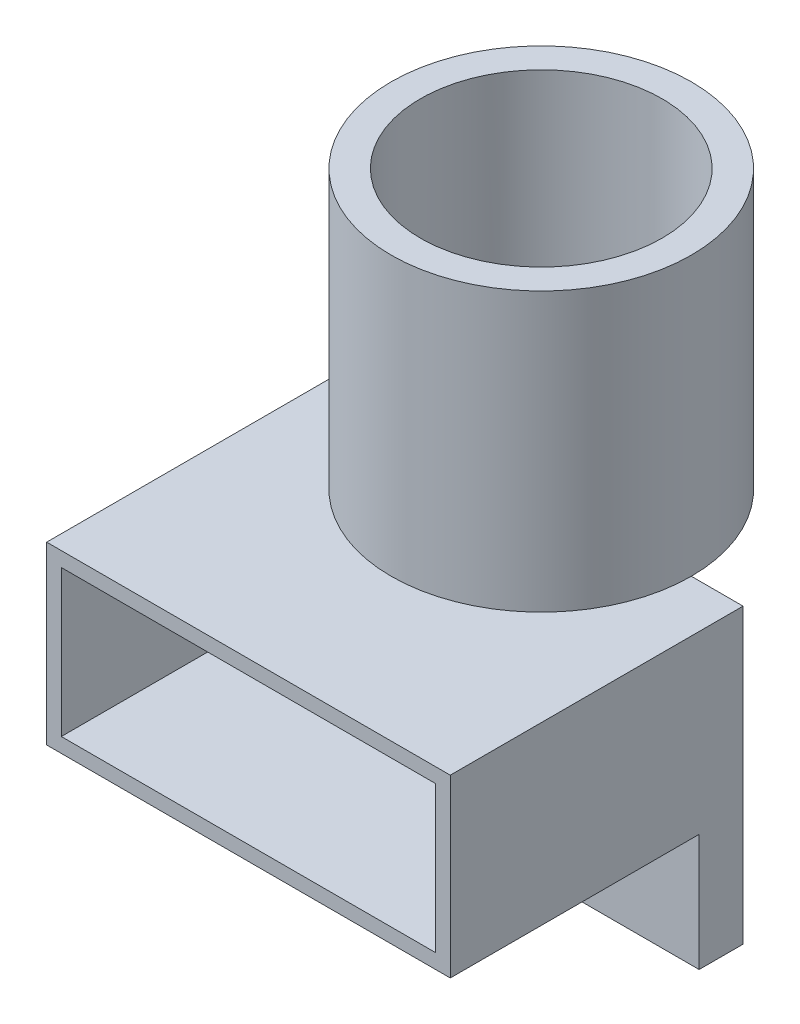
ISO-10303-21;
HEADER;
FILE_DESCRIPTION(('STEP AP214'),'2;1');
FILE_NAME('part.step','',(''),(''),'','','');
FILE_SCHEMA(('AUTOMOTIVE_DESIGN { 1 0 10303 214 1 1 1 1 }'));
ENDSEC;
DATA;
#1=APPLICATION_CONTEXT('core data for automotive mechanical design processes');
#2=APPLICATION_PROTOCOL_DEFINITION('international standard','automotive_design',2000,#1);
#3=PRODUCT_CONTEXT('',#1,'mechanical');
#4=PRODUCT('Part','Part','',(#3));
#5=PRODUCT_RELATED_PRODUCT_CATEGORY('part','',(#4));
#6=PRODUCT_DEFINITION_FORMATION('','',#4);
#7=PRODUCT_DEFINITION_CONTEXT('part definition',#1,'design');
#8=PRODUCT_DEFINITION('design','',#6,#7);
#9=PRODUCT_DEFINITION_SHAPE('','',#8);
#10=(LENGTH_UNIT() NAMED_UNIT(*) SI_UNIT(.MILLI.,.METRE.));
#11=(NAMED_UNIT(*) PLANE_ANGLE_UNIT() SI_UNIT($,.RADIAN.));
#12=(NAMED_UNIT(*) SI_UNIT($,.STERADIAN.) SOLID_ANGLE_UNIT());
#13=UNCERTAINTY_MEASURE_WITH_UNIT(LENGTH_MEASURE(1.E-05),#10,'distance_accuracy_value','');
#14=(GEOMETRIC_REPRESENTATION_CONTEXT(3) GLOBAL_UNCERTAINTY_ASSIGNED_CONTEXT((#13)) GLOBAL_UNIT_ASSIGNED_CONTEXT((#10,
#11,#12)) REPRESENTATION_CONTEXT('',''));
#15=CARTESIAN_POINT('',(0.,0.,0.));
#16=DIRECTION('',(0.,0.,1.));
#17=DIRECTION('',(1.,0.,0.));
#18=AXIS2_PLACEMENT_3D('',#15,#16,#17);
#19=CARTESIAN_POINT('',(-13.785,-12.,20.));
#20=DIRECTION('',(0.,1.,0.));
#21=DIRECTION('',(0.,0.,1.));
#22=AXIS2_PLACEMENT_3D('',#19,#20,#21);
#23=PLANE('',#22);
#24=DIRECTION('',(-1.,0.,0.));
#25=VECTOR('',#24,1.);
#26=CARTESIAN_POINT('',(-13.785,-12.,3.));
#27=LINE('',#26,#25);
#28=CARTESIAN_POINT('',(13.785,-12.,3.));
#29=VERTEX_POINT('',#28);
#30=CARTESIAN_POINT('',(-13.785,-12.,3.));
#31=VERTEX_POINT('',#30);
#32=EDGE_CURVE('E59',#29,#31,#27,.T.);
#33=ORIENTED_EDGE('',*,*,#32,.F.);
#34=DIRECTION('',(0.,0.,-1.));
#35=VECTOR('',#34,1.);
#36=CARTESIAN_POINT('',(13.785,-12.,20.));
#37=LINE('',#36,#35);
#38=CARTESIAN_POINT('',(13.785,-12.,20.));
#39=VERTEX_POINT('',#38);
#40=EDGE_CURVE('E232',#39,#29,#37,.T.);
#41=ORIENTED_EDGE('',*,*,#40,.F.);
#42=DIRECTION('',(1.,0.,0.));
#43=VECTOR('',#42,1.);
#44=CARTESIAN_POINT('',(-13.785,-12.,20.));
#45=LINE('',#44,#43);
#46=CARTESIAN_POINT('',(-13.785,-12.,20.));
#47=VERTEX_POINT('',#46);
#48=EDGE_CURVE('E217',#47,#39,#45,.T.);
#49=ORIENTED_EDGE('',*,*,#48,.F.);
#50=DIRECTION('',(0.,0.,-1.));
#51=VECTOR('',#50,1.);
#52=CARTESIAN_POINT('',(-13.785,-12.,20.));
#53=LINE('',#52,#51);
#54=EDGE_CURVE('E234',#47,#31,#53,.T.);
#55=ORIENTED_EDGE('',*,*,#54,.T.);
#56=EDGE_LOOP('',(#33,#41,#49,#55));
#57=FACE_BOUND('',#56,.T.);
#58=ADVANCED_FACE('F39',(#57),#23,.F.);
#59=CARTESIAN_POINT('',(0.,19.,0.));
#60=DIRECTION('',(0.,-1.,0.));
#61=DIRECTION('',(0.,0.,-1.));
#62=AXIS2_PLACEMENT_3D('',#59,#60,#61);
#63=CYLINDRICAL_SURFACE('',#62,10.255);
#64=CARTESIAN_POINT('',(0.,19.,0.));
#65=DIRECTION('',(0.,1.,0.));
#66=DIRECTION('',(0.,0.,1.));
#67=AXIS2_PLACEMENT_3D('',#64,#65,#66);
#68=CIRCLE('',#67,10.255);
#69=CARTESIAN_POINT('',(0.,19.,10.255));
#70=VERTEX_POINT('',#69);
#71=EDGE_CURVE('E254',#70,#70,#68,.T.);
#72=ORIENTED_EDGE('',*,*,#71,.F.);
#73=EDGE_LOOP('',(#72));
#74=FACE_BOUND('',#73,.T.);
#75=CARTESIAN_POINT('',(0.,0.,0.));
#76=DIRECTION('',(0.,-1.,0.));
#77=DIRECTION('',(0.,0.,-1.));
#78=AXIS2_PLACEMENT_3D('',#75,#76,#77);
#79=CIRCLE('',#78,10.255);
#80=CARTESIAN_POINT('',(10.255,0.,0.));
#81=VERTEX_POINT('',#80);
#82=CARTESIAN_POINT('',(-10.255,0.,0.));
#83=VERTEX_POINT('',#82);
#84=EDGE_CURVE('E239',#81,#83,#79,.T.);
#85=ORIENTED_EDGE('',*,*,#84,.F.);
#86=CARTESIAN_POINT('',(0.,0.,0.));
#87=DIRECTION('',(0.,1.,0.));
#88=DIRECTION('',(0.,0.,1.));
#89=AXIS2_PLACEMENT_3D('',#86,#87,#88);
#90=CIRCLE('',#89,10.255);
#91=EDGE_CURVE('E251',#81,#83,#90,.T.);
#92=ORIENTED_EDGE('',*,*,#91,.T.);
#93=EDGE_LOOP('',(#85,#92));
#94=FACE_BOUND('',#93,.T.);
#95=ADVANCED_FACE('F276',(#74,#94),#63,.T.);
#96=CARTESIAN_POINT('',(0.,19.,0.));
#97=DIRECTION('',(0.,-1.,0.));
#98=DIRECTION('',(0.,0.,-1.));
#99=AXIS2_PLACEMENT_3D('',#96,#97,#98);
#100=CYLINDRICAL_SURFACE('',#99,8.255);
#101=CARTESIAN_POINT('',(0.,19.,0.));
#102=DIRECTION('',(0.,1.,0.));
#103=DIRECTION('',(1.,0.,0.));
#104=AXIS2_PLACEMENT_3D('',#101,#102,#103);
#105=CIRCLE('',#104,8.255);
#106=CARTESIAN_POINT('',(8.255,19.,0.));
#107=VERTEX_POINT('',#106);
#108=EDGE_CURVE('E248',#107,#107,#105,.T.);
#109=ORIENTED_EDGE('',*,*,#108,.T.);
#110=EDGE_LOOP('',(#109));
#111=FACE_BOUND('',#110,.T.);
#112=CARTESIAN_POINT('',(0.,0.,0.));
#113=DIRECTION('',(0.,1.,0.));
#114=DIRECTION('',(1.,0.,0.));
#115=AXIS2_PLACEMENT_3D('',#112,#113,#114);
#116=CIRCLE('',#115,8.255);
#117=CARTESIAN_POINT('',(8.255,0.,0.));
#118=VERTEX_POINT('',#117);
#119=CARTESIAN_POINT('',(-8.255,0.,0.));
#120=VERTEX_POINT('',#119);
#121=EDGE_CURVE('E247',#118,#120,#116,.T.);
#122=ORIENTED_EDGE('',*,*,#121,.F.);
#123=DIRECTION('',(0.,-1.,0.));
#124=VECTOR('',#123,1.);
#125=CARTESIAN_POINT('',(8.255,-5.,0.));
#126=LINE('',#125,#124);
#127=CARTESIAN_POINT('',(8.255,-5.,0.));
#128=VERTEX_POINT('',#127);
#129=EDGE_CURVE('E262',#128,#118,#126,.F.);
#130=ORIENTED_EDGE('',*,*,#129,.F.);
#131=CARTESIAN_POINT('',(8.255,-5.,0.));
#132=CARTESIAN_POINT('',(8.25497331461349,-4.85988252701492,-1.49021935201769E-05));
#133=CARTESIAN_POINT('',(8.25499916117062,-4.71976715681473,0.00588924993427578));
#134=CARTESIAN_POINT('',(8.2549630650917,-4.44052956125955,0.0294281961175764));
#135=CARTESIAN_POINT('',(8.2549011253202,-4.30140730364727,0.0470626073940307));
#136=CARTESIAN_POINT('',(8.25449664300974,-4.02514658055255,0.0939527544222287));
#137=CARTESIAN_POINT('',(8.25415412277667,-3.88800795825498,0.123207566268263));
#138=CARTESIAN_POINT('',(8.25281510285722,-3.61667515296433,0.193126101982999));
#139=CARTESIAN_POINT('',(8.2518186113694,-3.48248093308039,0.23378968282139));
#140=CARTESIAN_POINT('',(8.24867967854686,-3.217921059573,0.326260476430858));
#141=CARTESIAN_POINT('',(8.24653663225715,-3.08755746543767,0.378073563363808));
#142=CARTESIAN_POINT('',(8.24049624153474,-2.83162951870208,0.492470531085829));
#143=CARTESIAN_POINT('',(8.23659828388386,-2.70606686034485,0.555058172098636));
#144=CARTESIAN_POINT('',(8.22635090749259,-2.46074896050054,0.690495489484591));
#145=CARTESIAN_POINT('',(8.22000215707984,-2.34099214578099,0.763342364742439));
#146=CARTESIAN_POINT('',(8.20408900119977,-2.10816171297895,0.91871876096218));
#147=CARTESIAN_POINT('',(8.19452476584704,-1.995087741714,1.0012477695424));
#148=CARTESIAN_POINT('',(8.17155011343072,-1.77809704432577,1.17399814559934));
#149=CARTESIAN_POINT('',(8.15819802707089,-1.67407052991278,1.26408927540027));
#150=CARTESIAN_POINT('',(8.12683641815329,-1.4741934695003,1.45211269175896));
#151=CARTESIAN_POINT('',(8.10882882381386,-1.37833956037644,1.5500417204495));
#152=CARTESIAN_POINT('',(8.06744957492375,-1.19557394862224,1.75270216639264));
#153=CARTESIAN_POINT('',(8.04408288835743,-1.10865407137235,1.85742721952175));
#154=CARTESIAN_POINT('',(7.99133814253856,-0.944281717758796,2.07263287725026));
#155=CARTESIAN_POINT('',(7.96196047470916,-0.866828625461257,2.18311310673502));
#156=CARTESIAN_POINT('',(7.89859695483386,-0.726115254424243,2.40195672457887));
#157=CARTESIAN_POINT('',(7.86498240699499,-0.662289004590599,2.51006425989123));
#158=CARTESIAN_POINT('',(7.7916561564975,-0.543662713628974,2.72918844376971));
#159=CARTESIAN_POINT('',(7.75194202363032,-0.488866288299333,2.84020623716102));
#160=CARTESIAN_POINT('',(7.6661934673308,-0.388330061312826,3.06413098359849));
#161=CARTESIAN_POINT('',(7.62014877113039,-0.342605281247342,3.17704073979718));
#162=CARTESIAN_POINT('',(7.52178671503046,-0.260243391702001,3.40337640005148));
#163=CARTESIAN_POINT('',(7.46947170048911,-0.223602899961471,3.51680209594647));
#164=CARTESIAN_POINT('',(7.35620720466247,-0.157692277546201,3.74813945890142));
#165=CARTESIAN_POINT('',(7.29497797226574,-0.128820326752928,3.86602738011827));
#166=CARTESIAN_POINT('',(7.16601185206531,-0.0801869862604324,4.10014317465971));
#167=CARTESIAN_POINT('',(7.09827302276098,-0.0604283248725657,4.2163705407736));
#168=CARTESIAN_POINT('',(6.95678978158156,-0.029448645632062,4.44592186517168));
#169=CARTESIAN_POINT('',(6.88305802285567,-0.0182101318957444,4.559251309013));
#170=CARTESIAN_POINT('',(6.72992975643756,-0.00348379542835875,4.78241147588552));
#171=CARTESIAN_POINT('',(6.65053780347084,1.01882175520652E-05,4.89224491144132));
#172=CARTESIAN_POINT('',(6.56848726877049,0.,5.));
#173=B_SPLINE_CURVE_WITH_KNOTS('',3,(#131,#132,#133,#134,#135,#136,#137,#138,#139,#140,#141,
#142,#143,#144,#145,#146,#147,#148,#149,#150,#151,#152,#153,#154,#155,#156,#157,#158,#159,#160,
#161,#162,#163,#164,#165,#166,#167,#168,#169,#170,#171,#172),.UNSPECIFIED.,.F.,.F.,(4,2,2,2,2,2,
2,2,2,2,2,2,2,2,2,2,2,2,2,2,4),(0.,0.420225119247416,0.840436526480485,1.26061453055927,
1.68078726715428,2.10118191780847,2.52172358099491,2.94215064399918,3.36255546789287,
3.77680834621314,4.19088992338354,4.60458917931134,5.01826150453521,5.40767296279356,
5.79723997554025,6.18744677858611,6.57750808099107,6.98484051177167,7.39229480958079,
7.79891012805147,8.20520186035512),.UNSPECIFIED.);
#174=CARTESIAN_POINT('',(6.56848726877049,0.,4.99999999999999));
#175=VERTEX_POINT('',#174);
#176=EDGE_CURVE('E12',#128,#175,#173,.T.);
#177=ORIENTED_EDGE('',*,*,#176,.T.);
#178=CARTESIAN_POINT('',(0.,0.,0.));
#179=DIRECTION('',(0.,-1.,0.));
#180=DIRECTION('',(0.,0.,-1.));
#181=AXIS2_PLACEMENT_3D('',#178,#179,#180);
#182=CIRCLE('',#181,8.255);
#183=CARTESIAN_POINT('',(-6.56848726877049,0.,5.));
#184=VERTEX_POINT('',#183);
#185=EDGE_CURVE('E236',#175,#184,#182,.T.);
#186=ORIENTED_EDGE('',*,*,#185,.T.);
#187=CARTESIAN_POINT('',(-6.56848726877049,0.,5.));
#188=CARTESIAN_POINT('',(-6.65234995484222,1.12039857409779E-05,4.88986755808025));
#189=CARTESIAN_POINT('',(-6.73343478311541,-0.00363927133751894,4.77756140971143));
#190=CARTESIAN_POINT('',(-6.88968636795299,-0.0190410512372556,4.5493174870373));
#191=CARTESIAN_POINT('',(-6.96484830200669,-0.0307988825356666,4.43337685867417));
#192=CARTESIAN_POINT('',(-7.10893792075538,-0.0632364943649566,4.19846197129244));
#193=CARTESIAN_POINT('',(-7.17784928778702,-0.0839388577831941,4.07948075568399));
#194=CARTESIAN_POINT('',(-7.30884334610591,-0.134914726557473,3.83985233097008));
#195=CARTESIAN_POINT('',(-7.37092792320918,-0.165185579739175,3.71920559236199));
#196=CARTESIAN_POINT('',(-7.4883480228647,-0.235990029396108,3.47676681461346));
#197=CARTESIAN_POINT('',(-7.54364541326722,-0.276577997066371,3.35497210632506));
#198=CARTESIAN_POINT('',(-7.64698865632897,-0.368243900344679,3.1122325884408));
#199=CARTESIAN_POINT('',(-7.69503384447616,-0.41932279621492,2.99128785769443));
#200=CARTESIAN_POINT('',(-7.78383116610327,-0.531919368292093,2.75195495877767));
#201=CARTESIAN_POINT('',(-7.82459896452051,-0.593414053626837,2.63356179368059));
#202=CARTESIAN_POINT('',(-7.89921659867603,-0.726758502469405,2.40049463586602));
#203=CARTESIAN_POINT('',(-7.93306702129016,-0.79860738663583,2.28582032833268));
#204=CARTESIAN_POINT('',(-7.99177237192207,-0.945982761915618,2.07074709121387));
#205=CARTESIAN_POINT('',(-8.01713716760628,-1.0207252621898,1.96994845015721));
#206=CARTESIAN_POINT('',(-8.06285819475469,-1.17822975342711,1.77355914972444));
#207=CARTESIAN_POINT('',(-8.08321266925263,-1.26099454342173,1.6779703263946));
#208=CARTESIAN_POINT('',(-8.1194366269714,-1.43403200034803,1.49287432260273));
#209=CARTESIAN_POINT('',(-8.13530441799617,-1.5243074834405,1.40336944640213));
#210=CARTESIAN_POINT('',(-8.16313480705727,-1.71178121281649,1.23120430129868));
#211=CARTESIAN_POINT('',(-8.17509597189955,-1.8089819838331,1.14854655263068));
#212=CARTESIAN_POINT('',(-8.19586299152697,-2.01107029691955,0.989631170096774));
#213=CARTESIAN_POINT('',(-8.20462136255448,-2.1160477665559,0.91348175230814));
#214=CARTESIAN_POINT('',(-8.21937635708455,-2.33173954076825,0.769491482347934));
#215=CARTESIAN_POINT('',(-8.22537285877517,-2.44245409813836,0.701650996737772));
#216=CARTESIAN_POINT('',(-8.23521501141591,-2.66894064263214,0.574729420678005));
#217=CARTESIAN_POINT('',(-8.23905983604071,-2.78471455436314,0.5156517018546));
#218=CARTESIAN_POINT('',(-8.24515634275062,-3.02050929402075,0.406691494903264));
#219=CARTESIAN_POINT('',(-8.24740843040359,-3.1405290326286,0.35680666832988));
#220=CARTESIAN_POINT('',(-8.25105539295605,-3.40088562092269,0.260309670068906));
#221=CARTESIAN_POINT('',(-8.25228954128175,-3.54174452935713,0.215093861170852));
#222=CARTESIAN_POINT('',(-8.25394905104013,-3.82693203364714,0.137308667318047));
#223=CARTESIAN_POINT('',(-8.25437429541961,-3.97126112859974,0.104741113183223));
#224=CARTESIAN_POINT('',(-8.25487700095012,-4.26241288174185,0.0524903487073743));
#225=CARTESIAN_POINT('',(-8.25495404524261,-4.40923831763943,0.0328226058323825));
#226=CARTESIAN_POINT('',(-8.25499896371693,-4.70404188862832,0.00656857746174367));
#227=CARTESIAN_POINT('',(-8.25496684661968,-4.85201993069543,-1.8752963271178E-05));
#228=CARTESIAN_POINT('',(-8.255,-5.,0.));
#229=B_SPLINE_CURVE_WITH_KNOTS('',3,(#187,#188,#189,#190,#191,#192,#193,#194,#195,#196,#197,
#198,#199,#200,#201,#202,#203,#204,#205,#206,#207,#208,#209,#210,#211,#212,#213,#214,#215,#216,
#217,#218,#219,#220,#221,#222,#223,#224,#225,#226,#227,#228),.UNSPECIFIED.,.F.,.F.,(4,2,2,2,2,2,
2,2,2,2,2,2,2,2,2,2,2,2,2,2,4),(0.,0.415258865613753,0.830852420897809,1.24750144280537,
1.66403507991079,2.08281108513076,2.50162543911427,2.91952710842384,3.33739330787984,
3.72101299191601,4.10476700860083,4.48866556934857,4.87270481023969,5.2622266849412,
5.65176573781821,6.04145428593707,6.43104356963867,6.87427557709155,7.31757171796288,
7.76139842424205,8.20518967397719),.UNSPECIFIED.);
#230=CARTESIAN_POINT('',(-8.255,-5.,0.));
#231=VERTEX_POINT('',#230);
#232=EDGE_CURVE('E52',#184,#231,#229,.T.);
#233=ORIENTED_EDGE('',*,*,#232,.T.);
#234=DIRECTION('',(0.,-1.,0.));
#235=VECTOR('',#234,1.);
#236=CARTESIAN_POINT('',(-8.255,0.,0.));
#237=LINE('',#236,#235);
#238=EDGE_CURVE('E67',#120,#231,#237,.T.);
#239=ORIENTED_EDGE('',*,*,#238,.F.);
#240=EDGE_LOOP('',(#122,#130,#177,#186,#233,#239));
#241=FACE_BOUND('',#240,.T.);
#242=ADVANCED_FACE('F270',(#111,#241),#100,.F.);
#243=CARTESIAN_POINT('',(0.,0.,0.));
#244=DIRECTION('',(0.,1.,0.));
#245=DIRECTION('',(0.,0.,1.));
#246=AXIS2_PLACEMENT_3D('',#243,#244,#245);
#247=PLANE('',#246);
#248=DIRECTION('',(1.,0.,0.));
#249=VECTOR('',#248,1.);
#250=CARTESIAN_POINT('',(8.255,0.,0.));
#251=LINE('',#250,#249);
#252=EDGE_CURVE('E242',#118,#81,#251,.T.);
#253=ORIENTED_EDGE('',*,*,#252,.F.);
#254=ORIENTED_EDGE('',*,*,#121,.T.);
#255=DIRECTION('',(1.,0.,0.));
#256=VECTOR('',#255,1.);
#257=CARTESIAN_POINT('',(-10.255,0.,0.));
#258=LINE('',#257,#256);
#259=EDGE_CURVE('E245',#83,#120,#258,.T.);
#260=ORIENTED_EDGE('',*,*,#259,.F.);
#261=ORIENTED_EDGE('',*,*,#91,.F.);
#262=EDGE_LOOP('',(#253,#254,#260,#261));
#263=FACE_BOUND('',#262,.T.);
#264=ADVANCED_FACE('F275',(#263),#247,.F.);
#265=CARTESIAN_POINT('',(0.,19.,0.));
#266=DIRECTION('',(0.,1.,0.));
#267=DIRECTION('',(0.,0.,1.));
#268=AXIS2_PLACEMENT_3D('',#265,#266,#267);
#269=PLANE('',#268);
#270=ORIENTED_EDGE('',*,*,#71,.T.);
#271=EDGE_LOOP('',(#270));
#272=FACE_BOUND('',#271,.T.);
#273=ORIENTED_EDGE('',*,*,#108,.F.);
#274=EDGE_LOOP('',(#273));
#275=FACE_BOUND('',#274,.T.);
#276=ADVANCED_FACE('F279',(#272,#275),#269,.T.);
#277=CARTESIAN_POINT('',(-10.255,-11.,0.));
#278=DIRECTION('',(0.,0.,1.));
#279=DIRECTION('',(1.,0.,0.));
#280=AXIS2_PLACEMENT_3D('',#277,#278,#279);
#281=PLANE('',#280);
#282=ORIENTED_EDGE('',*,*,#259,.T.);
#283=ORIENTED_EDGE('',*,*,#238,.T.);
#284=DIRECTION('',(-1.,0.,0.));
#285=VECTOR('',#284,1.);
#286=CARTESIAN_POINT('',(-10.255,-5.,0.));
#287=LINE('',#286,#285);
#288=EDGE_CURVE('E264',#231,#128,#287,.F.);
#289=ORIENTED_EDGE('',*,*,#288,.T.);
#290=ORIENTED_EDGE('',*,*,#129,.T.);
#291=ORIENTED_EDGE('',*,*,#252,.T.);
#292=DIRECTION('',(-1.,0.,0.));
#293=VECTOR('',#292,1.);
#294=CARTESIAN_POINT('',(-13.785,0.,0.));
#295=LINE('',#294,#293);
#296=CARTESIAN_POINT('',(13.785,0.,0.));
#297=VERTEX_POINT('',#296);
#298=EDGE_CURVE('E218',#297,#81,#295,.T.);
#299=ORIENTED_EDGE('',*,*,#298,.F.);
#300=DIRECTION('',(0.,1.,0.));
#301=VECTOR('',#300,1.);
#302=CARTESIAN_POINT('',(13.785,0.,0.));
#303=LINE('',#302,#301);
#304=CARTESIAN_POINT('',(13.785,-20.,0.));
#305=VERTEX_POINT('',#304);
#306=EDGE_CURVE('E158',#305,#297,#303,.T.);
#307=ORIENTED_EDGE('',*,*,#306,.F.);
#308=DIRECTION('',(1.,0.,0.));
#309=VECTOR('',#308,1.);
#310=CARTESIAN_POINT('',(-13.785,-20.,0.));
#311=LINE('',#310,#309);
#312=CARTESIAN_POINT('',(-13.785,-20.,0.));
#313=VERTEX_POINT('',#312);
#314=EDGE_CURVE('E162',#313,#305,#311,.T.);
#315=ORIENTED_EDGE('',*,*,#314,.F.);
#316=DIRECTION('',(0.,-1.,0.));
#317=VECTOR('',#316,1.);
#318=CARTESIAN_POINT('',(-13.785,0.,0.));
#319=LINE('',#318,#317);
#320=CARTESIAN_POINT('',(-13.785,0.,0.));
#321=VERTEX_POINT('',#320);
#322=EDGE_CURVE('E147',#321,#313,#319,.T.);
#323=ORIENTED_EDGE('',*,*,#322,.F.);
#324=EDGE_CURVE('E225',#83,#321,#295,.T.);
#325=ORIENTED_EDGE('',*,*,#324,.F.);
#326=EDGE_LOOP('',(#282,#283,#289,#290,#291,#299,#307,#315,#323,#325));
#327=FACE_BOUND('',#326,.T.);
#328=ADVANCED_FACE('F163',(#327),#281,.F.);
#329=CARTESIAN_POINT('',(-13.785,0.,20.));
#330=DIRECTION('',(0.,-1.,0.));
#331=DIRECTION('',(0.,0.,-1.));
#332=AXIS2_PLACEMENT_3D('',#329,#330,#331);
#333=PLANE('',#332);
#334=ORIENTED_EDGE('',*,*,#298,.T.);
#335=ORIENTED_EDGE('',*,*,#84,.T.);
#336=ORIENTED_EDGE('',*,*,#324,.T.);
#337=DIRECTION('',(0.,0.,-1.));
#338=VECTOR('',#337,1.);
#339=CARTESIAN_POINT('',(-13.785,0.,20.));
#340=LINE('',#339,#338);
#341=CARTESIAN_POINT('',(-13.785,0.,20.));
#342=VERTEX_POINT('',#341);
#343=EDGE_CURVE('E155',#342,#321,#340,.T.);
#344=ORIENTED_EDGE('',*,*,#343,.F.);
#345=DIRECTION('',(-1.,0.,0.));
#346=VECTOR('',#345,1.);
#347=CARTESIAN_POINT('',(-13.785,0.,20.));
#348=LINE('',#347,#346);
#349=CARTESIAN_POINT('',(13.785,0.,20.));
#350=VERTEX_POINT('',#349);
#351=EDGE_CURVE('E222',#350,#342,#348,.T.);
#352=ORIENTED_EDGE('',*,*,#351,.F.);
#353=DIRECTION('',(0.,0.,-1.));
#354=VECTOR('',#353,1.);
#355=CARTESIAN_POINT('',(13.785,0.,20.));
#356=LINE('',#355,#354);
#357=EDGE_CURVE('E229',#350,#297,#356,.T.);
#358=ORIENTED_EDGE('',*,*,#357,.T.);
#359=EDGE_LOOP('',(#334,#335,#336,#344,#352,#358));
#360=FACE_BOUND('',#359,.T.);
#361=ADVANCED_FACE('F297',(#360),#333,.F.);
#362=CARTESIAN_POINT('',(-13.785,0.,20.));
#363=DIRECTION('',(1.,0.,0.));
#364=DIRECTION('',(0.,1.,0.));
#365=AXIS2_PLACEMENT_3D('',#362,#363,#364);
#366=PLANE('',#365);
#367=ORIENTED_EDGE('',*,*,#322,.T.);
#368=DIRECTION('',(0.,0.,-1.));
#369=VECTOR('',#368,1.);
#370=CARTESIAN_POINT('',(-13.785,-20.,0.));
#371=LINE('',#370,#369);
#372=CARTESIAN_POINT('',(-13.785,-20.,3.));
#373=VERTEX_POINT('',#372);
#374=EDGE_CURVE('E152',#373,#313,#371,.T.);
#375=ORIENTED_EDGE('',*,*,#374,.F.);
#376=DIRECTION('',(0.,1.,0.));
#377=VECTOR('',#376,1.);
#378=CARTESIAN_POINT('',(-13.785,-20.,3.));
#379=LINE('',#378,#377);
#380=EDGE_CURVE('E177',#373,#31,#379,.T.);
#381=ORIENTED_EDGE('',*,*,#380,.T.);
#382=ORIENTED_EDGE('',*,*,#54,.F.);
#383=DIRECTION('',(0.,-1.,0.));
#384=VECTOR('',#383,1.);
#385=CARTESIAN_POINT('',(-13.785,0.,20.));
#386=LINE('',#385,#384);
#387=EDGE_CURVE('E214',#342,#47,#386,.T.);
#388=ORIENTED_EDGE('',*,*,#387,.F.);
#389=ORIENTED_EDGE('',*,*,#343,.T.);
#390=EDGE_LOOP('',(#367,#375,#381,#382,#388,#389));
#391=FACE_BOUND('',#390,.T.);
#392=ADVANCED_FACE('F149',(#391),#366,.F.);
#393=CARTESIAN_POINT('',(13.785,0.,20.));
#394=DIRECTION('',(-1.,0.,0.));
#395=DIRECTION('',(0.,-1.,0.));
#396=AXIS2_PLACEMENT_3D('',#393,#394,#395);
#397=PLANE('',#396);
#398=ORIENTED_EDGE('',*,*,#306,.T.);
#399=ORIENTED_EDGE('',*,*,#357,.F.);
#400=DIRECTION('',(0.,1.,0.));
#401=VECTOR('',#400,1.);
#402=CARTESIAN_POINT('',(13.785,0.,20.));
#403=LINE('',#402,#401);
#404=EDGE_CURVE('E220',#39,#350,#403,.T.);
#405=ORIENTED_EDGE('',*,*,#404,.F.);
#406=ORIENTED_EDGE('',*,*,#40,.T.);
#407=DIRECTION('',(0.,1.,0.));
#408=VECTOR('',#407,1.);
#409=CARTESIAN_POINT('',(13.785,-20.,3.));
#410=LINE('',#409,#408);
#411=CARTESIAN_POINT('',(13.785,-20.,3.));
#412=VERTEX_POINT('',#411);
#413=EDGE_CURVE('E180',#412,#29,#410,.T.);
#414=ORIENTED_EDGE('',*,*,#413,.F.);
#415=DIRECTION('',(0.,0.,1.));
#416=VECTOR('',#415,1.);
#417=CARTESIAN_POINT('',(13.785,-20.,0.));
#418=LINE('',#417,#416);
#419=EDGE_CURVE('E167',#305,#412,#418,.T.);
#420=ORIENTED_EDGE('',*,*,#419,.F.);
#421=EDGE_LOOP('',(#398,#399,#405,#406,#414,#420));
#422=FACE_BOUND('',#421,.T.);
#423=ADVANCED_FACE('F302',(#422),#397,.F.);
#424=ORIENTED_EDGE('',*,*,#185,.F.);
#425=DIRECTION('',(-1.,0.,0.));
#426=VECTOR('',#425,1.);
#427=CARTESIAN_POINT('',(-13.785,0.,5.));
#428=LINE('',#427,#426);
#429=EDGE_CURVE('E257',#175,#184,#428,.T.);
#430=ORIENTED_EDGE('',*,*,#429,.T.);
#431=EDGE_LOOP('',(#424,#430));
#432=FACE_BOUND('',#431,.T.);
#433=ADVANCED_FACE('F315',(#432),#333,.F.);
#434=CARTESIAN_POINT('',(0.,0.,20.));
#435=DIRECTION('',(0.,0.,1.));
#436=DIRECTION('',(1.,0.,0.));
#437=AXIS2_PLACEMENT_3D('',#434,#435,#436);
#438=PLANE('',#437);
#439=DIRECTION('',(0.,-1.,0.));
#440=VECTOR('',#439,1.);
#441=CARTESIAN_POINT('',(-12.785,-1.,20.));
#442=LINE('',#441,#440);
#443=CARTESIAN_POINT('',(-12.785,-1.,20.));
#444=VERTEX_POINT('',#443);
#445=CARTESIAN_POINT('',(-12.785,-11.,20.));
#446=VERTEX_POINT('',#445);
#447=EDGE_CURVE('E183',#444,#446,#442,.T.);
#448=ORIENTED_EDGE('',*,*,#447,.F.);
#449=DIRECTION('',(-1.,0.,0.));
#450=VECTOR('',#449,1.);
#451=CARTESIAN_POINT('',(-12.785,-1.,20.));
#452=LINE('',#451,#450);
#453=CARTESIAN_POINT('',(12.785,-1.,20.));
#454=VERTEX_POINT('',#453);
#455=EDGE_CURVE('E188',#454,#444,#452,.T.);
#456=ORIENTED_EDGE('',*,*,#455,.F.);
#457=DIRECTION('',(0.,1.,0.));
#458=VECTOR('',#457,1.);
#459=CARTESIAN_POINT('',(12.785,-1.,20.));
#460=LINE('',#459,#458);
#461=CARTESIAN_POINT('',(12.785,-11.,20.));
#462=VERTEX_POINT('',#461);
#463=EDGE_CURVE('E202',#462,#454,#460,.T.);
#464=ORIENTED_EDGE('',*,*,#463,.F.);
#465=DIRECTION('',(1.,0.,0.));
#466=VECTOR('',#465,1.);
#467=CARTESIAN_POINT('',(-12.785,-11.,20.));
#468=LINE('',#467,#466);
#469=EDGE_CURVE('E199',#446,#462,#468,.T.);
#470=ORIENTED_EDGE('',*,*,#469,.F.);
#471=EDGE_LOOP('',(#448,#456,#464,#470));
#472=FACE_BOUND('',#471,.T.);
#473=ORIENTED_EDGE('',*,*,#387,.T.);
#474=ORIENTED_EDGE('',*,*,#48,.T.);
#475=ORIENTED_EDGE('',*,*,#404,.T.);
#476=ORIENTED_EDGE('',*,*,#351,.T.);
#477=EDGE_LOOP('',(#473,#474,#475,#476));
#478=FACE_BOUND('',#477,.T.);
#479=ADVANCED_FACE('F308',(#472,#478),#438,.T.);
#480=CARTESIAN_POINT('',(-12.785,-1.,5.));
#481=DIRECTION('',(-1.,0.,0.));
#482=DIRECTION('',(0.,-1.,0.));
#483=AXIS2_PLACEMENT_3D('',#480,#481,#482);
#484=PLANE('',#483);
#485=ORIENTED_EDGE('',*,*,#447,.T.);
#486=DIRECTION('',(0.,0.,1.));
#487=VECTOR('',#486,1.);
#488=CARTESIAN_POINT('',(-12.785,-11.,5.));
#489=LINE('',#488,#487);
#490=CARTESIAN_POINT('',(-12.785,-11.,5.));
#491=VERTEX_POINT('',#490);
#492=EDGE_CURVE('E197',#491,#446,#489,.T.);
#493=ORIENTED_EDGE('',*,*,#492,.F.);
#494=DIRECTION('',(0.,-1.,0.));
#495=VECTOR('',#494,1.);
#496=CARTESIAN_POINT('',(-12.785,-1.,5.));
#497=LINE('',#496,#495);
#498=CARTESIAN_POINT('',(-12.785,-1.,5.));
#499=VERTEX_POINT('',#498);
#500=EDGE_CURVE('E184',#499,#491,#497,.T.);
#501=ORIENTED_EDGE('',*,*,#500,.F.);
#502=DIRECTION('',(0.,0.,1.));
#503=VECTOR('',#502,1.);
#504=CARTESIAN_POINT('',(-12.785,-1.,5.));
#505=LINE('',#504,#503);
#506=EDGE_CURVE('E159',#499,#444,#505,.T.);
#507=ORIENTED_EDGE('',*,*,#506,.T.);
#508=EDGE_LOOP('',(#485,#493,#501,#507));
#509=FACE_BOUND('',#508,.T.);
#510=ADVANCED_FACE('F322',(#509),#484,.F.);
#511=CARTESIAN_POINT('',(-12.785,-1.,5.));
#512=DIRECTION('',(0.,1.,0.));
#513=DIRECTION('',(0.,0.,1.));
#514=AXIS2_PLACEMENT_3D('',#511,#512,#513);
#515=PLANE('',#514);
#516=ORIENTED_EDGE('',*,*,#455,.T.);
#517=ORIENTED_EDGE('',*,*,#506,.F.);
#518=DIRECTION('',(-1.,0.,0.));
#519=VECTOR('',#518,1.);
#520=CARTESIAN_POINT('',(-12.785,-1.,5.));
#521=LINE('',#520,#519);
#522=CARTESIAN_POINT('',(12.785,-1.,5.));
#523=VERTEX_POINT('',#522);
#524=EDGE_CURVE('E194',#523,#499,#521,.T.);
#525=ORIENTED_EDGE('',*,*,#524,.F.);
#526=DIRECTION('',(0.,0.,1.));
#527=VECTOR('',#526,1.);
#528=CARTESIAN_POINT('',(12.785,-1.,5.));
#529=LINE('',#528,#527);
#530=EDGE_CURVE('E208',#523,#454,#529,.T.);
#531=ORIENTED_EDGE('',*,*,#530,.T.);
#532=EDGE_LOOP('',(#516,#517,#525,#531));
#533=FACE_BOUND('',#532,.T.);
#534=ADVANCED_FACE('F418',(#533),#515,.F.);
#535=CARTESIAN_POINT('',(12.785,-1.,5.));
#536=DIRECTION('',(1.,0.,0.));
#537=DIRECTION('',(0.,1.,0.));
#538=AXIS2_PLACEMENT_3D('',#535,#536,#537);
#539=PLANE('',#538);
#540=ORIENTED_EDGE('',*,*,#463,.T.);
#541=ORIENTED_EDGE('',*,*,#530,.F.);
#542=DIRECTION('',(0.,1.,0.));
#543=VECTOR('',#542,1.);
#544=CARTESIAN_POINT('',(12.785,-1.,5.));
#545=LINE('',#544,#543);
#546=CARTESIAN_POINT('',(12.785,-11.,5.));
#547=VERTEX_POINT('',#546);
#548=EDGE_CURVE('E191',#547,#523,#545,.T.);
#549=ORIENTED_EDGE('',*,*,#548,.F.);
#550=DIRECTION('',(0.,0.,1.));
#551=VECTOR('',#550,1.);
#552=CARTESIAN_POINT('',(12.785,-11.,5.));
#553=LINE('',#552,#551);
#554=EDGE_CURVE('E210',#547,#462,#553,.T.);
#555=ORIENTED_EDGE('',*,*,#554,.T.);
#556=EDGE_LOOP('',(#540,#541,#549,#555));
#557=FACE_BOUND('',#556,.T.);
#558=ADVANCED_FACE('F421',(#557),#539,.F.);
#559=CARTESIAN_POINT('',(-12.785,-11.,5.));
#560=DIRECTION('',(0.,-1.,0.));
#561=DIRECTION('',(0.,0.,-1.));
#562=AXIS2_PLACEMENT_3D('',#559,#560,#561);
#563=PLANE('',#562);
#564=ORIENTED_EDGE('',*,*,#469,.T.);
#565=ORIENTED_EDGE('',*,*,#554,.F.);
#566=DIRECTION('',(1.,0.,0.));
#567=VECTOR('',#566,1.);
#568=CARTESIAN_POINT('',(-12.785,-11.,5.));
#569=LINE('',#568,#567);
#570=EDGE_CURVE('E187',#491,#547,#569,.T.);
#571=ORIENTED_EDGE('',*,*,#570,.F.);
#572=ORIENTED_EDGE('',*,*,#492,.T.);
#573=EDGE_LOOP('',(#564,#565,#571,#572));
#574=FACE_BOUND('',#573,.T.);
#575=ADVANCED_FACE('F416',(#574),#563,.F.);
#576=CARTESIAN_POINT('',(0.,0.,5.));
#577=DIRECTION('',(0.,0.,1.));
#578=DIRECTION('',(1.,0.,0.));
#579=AXIS2_PLACEMENT_3D('',#576,#577,#578);
#580=PLANE('',#579);
#581=ORIENTED_EDGE('',*,*,#500,.T.);
#582=ORIENTED_EDGE('',*,*,#570,.T.);
#583=ORIENTED_EDGE('',*,*,#548,.T.);
#584=ORIENTED_EDGE('',*,*,#524,.T.);
#585=EDGE_LOOP('',(#581,#582,#583,#584));
#586=FACE_BOUND('',#585,.T.);
#587=ADVANCED_FACE('F354',(#586),#580,.T.);
#588=CARTESIAN_POINT('',(-13.785,-5.,5.));
#589=DIRECTION('',(-1.,0.,0.));
#590=DIRECTION('',(0.,0.,1.));
#591=AXIS2_PLACEMENT_3D('',#588,#589,#590);
#592=CYLINDRICAL_SURFACE('',#591,5.);
#593=ORIENTED_EDGE('',*,*,#176,.F.);
#594=ORIENTED_EDGE('',*,*,#288,.F.);
#595=ORIENTED_EDGE('',*,*,#232,.F.);
#596=ORIENTED_EDGE('',*,*,#429,.F.);
#597=EDGE_LOOP('',(#593,#594,#595,#596));
#598=FACE_BOUND('',#597,.T.);
#599=ADVANCED_FACE('F41',(#598),#592,.T.);
#600=CARTESIAN_POINT('',(-13.785,-20.,3.));
#601=DIRECTION('',(0.,0.,-1.));
#602=DIRECTION('',(-1.,0.,0.));
#603=AXIS2_PLACEMENT_3D('',#600,#601,#602);
#604=PLANE('',#603);
#605=ORIENTED_EDGE('',*,*,#32,.T.);
#606=ORIENTED_EDGE('',*,*,#380,.F.);
#607=DIRECTION('',(-1.,0.,0.));
#608=VECTOR('',#607,1.);
#609=CARTESIAN_POINT('',(-13.785,-20.,3.));
#610=LINE('',#609,#608);
#611=EDGE_CURVE('E171',#412,#373,#610,.T.);
#612=ORIENTED_EDGE('',*,*,#611,.F.);
#613=ORIENTED_EDGE('',*,*,#413,.T.);
#614=EDGE_LOOP('',(#605,#606,#612,#613));
#615=FACE_BOUND('',#614,.T.);
#616=ADVANCED_FACE('F305',(#615),#604,.F.);
#617=CARTESIAN_POINT('',(0.,-20.,0.));
#618=DIRECTION('',(0.,1.,0.));
#619=DIRECTION('',(0.,0.,1.));
#620=AXIS2_PLACEMENT_3D('',#617,#618,#619);
#621=PLANE('',#620);
#622=ORIENTED_EDGE('',*,*,#374,.T.);
#623=ORIENTED_EDGE('',*,*,#314,.T.);
#624=ORIENTED_EDGE('',*,*,#419,.T.);
#625=ORIENTED_EDGE('',*,*,#611,.T.);
#626=EDGE_LOOP('',(#622,#623,#624,#625));
#627=FACE_BOUND('',#626,.T.);
#628=ADVANCED_FACE('F169',(#627),#621,.F.);
#629=CLOSED_SHELL('',(#58,#95,#242,#264,#276,#328,#361,#392,#423,#433,#479,#510,#534,#558,#575,
#587,#599,#616,#628));
#630=MANIFOLD_SOLID_BREP('B2',#629);
#631=ADVANCED_BREP_SHAPE_REPRESENTATION('',(#18,#630),#14);
#632=SHAPE_DEFINITION_REPRESENTATION(#9,#631);
ENDSEC;
END-ISO-10303-21;
